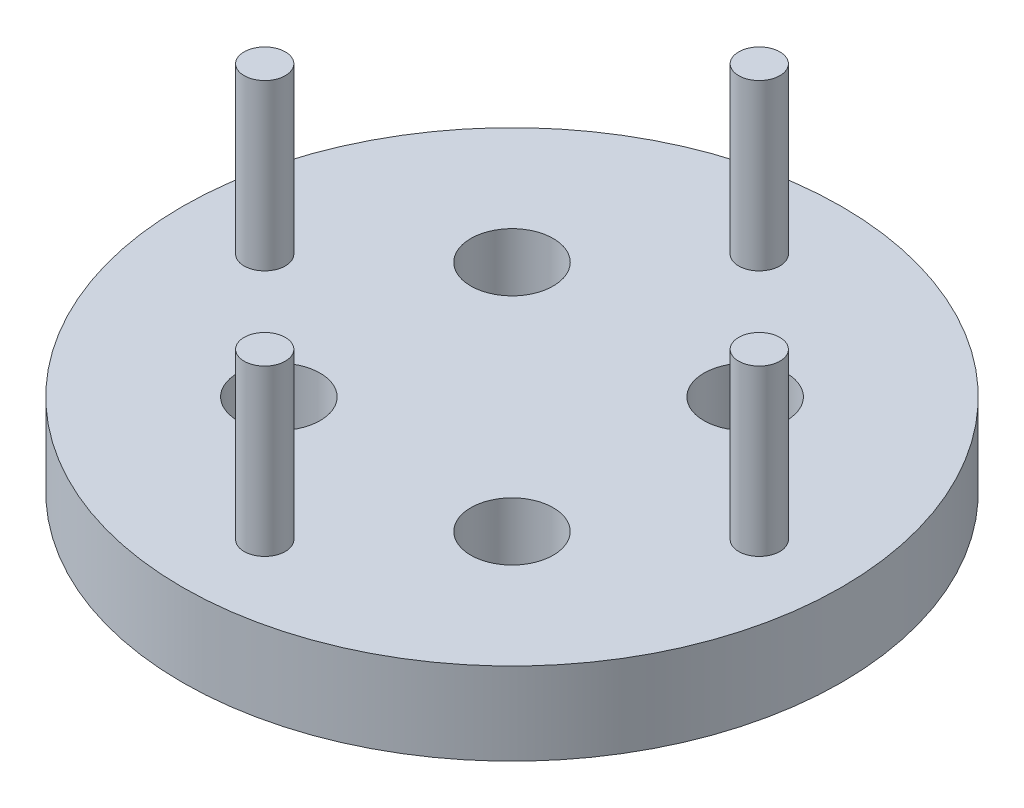
ISO-10303-21;
HEADER;
FILE_DESCRIPTION(('STEP AP214'),'2;1');
FILE_NAME('part.step','',(''),(''),'','','');
FILE_SCHEMA(('AUTOMOTIVE_DESIGN { 1 0 10303 214 1 1 1 1 }'));
ENDSEC;
DATA;
#1=APPLICATION_CONTEXT('core data for automotive mechanical design processes');
#2=APPLICATION_PROTOCOL_DEFINITION('international standard','automotive_design',2000,#1);
#3=PRODUCT_CONTEXT('',#1,'mechanical');
#4=PRODUCT('Part','Part','',(#3));
#5=PRODUCT_RELATED_PRODUCT_CATEGORY('part','',(#4));
#6=PRODUCT_DEFINITION_FORMATION('','',#4);
#7=PRODUCT_DEFINITION_CONTEXT('part definition',#1,'design');
#8=PRODUCT_DEFINITION('design','',#6,#7);
#9=PRODUCT_DEFINITION_SHAPE('','',#8);
#10=(LENGTH_UNIT() NAMED_UNIT(*) SI_UNIT(.MILLI.,.METRE.));
#11=(NAMED_UNIT(*) PLANE_ANGLE_UNIT() SI_UNIT($,.RADIAN.));
#12=(NAMED_UNIT(*) SI_UNIT($,.STERADIAN.) SOLID_ANGLE_UNIT());
#13=UNCERTAINTY_MEASURE_WITH_UNIT(LENGTH_MEASURE(1.E-05),#10,'distance_accuracy_value','');
#14=(GEOMETRIC_REPRESENTATION_CONTEXT(3) GLOBAL_UNCERTAINTY_ASSIGNED_CONTEXT((#13)) GLOBAL_UNIT_ASSIGNED_CONTEXT((#10,
#11,#12)) REPRESENTATION_CONTEXT('',''));
#15=CARTESIAN_POINT('',(0.,0.,0.));
#16=DIRECTION('',(0.,0.,1.));
#17=DIRECTION('',(1.,0.,0.));
#18=AXIS2_PLACEMENT_3D('',#15,#16,#17);
#19=CARTESIAN_POINT('',(0.,6.35,0.));
#20=DIRECTION('',(0.,-1.,0.));
#21=DIRECTION('',(0.,0.,-1.));
#22=AXIS2_PLACEMENT_3D('',#19,#20,#21);
#23=CYLINDRICAL_SURFACE('',#22,25.4);
#24=CARTESIAN_POINT('',(0.,6.35,0.));
#25=DIRECTION('',(0.,1.,0.));
#26=DIRECTION('',(0.,0.,1.));
#27=AXIS2_PLACEMENT_3D('',#24,#25,#26);
#28=CIRCLE('',#27,25.4);
#29=CARTESIAN_POINT('',(0.,6.35,25.4));
#30=VERTEX_POINT('',#29);
#31=EDGE_CURVE('E10',#30,#30,#28,.T.);
#32=ORIENTED_EDGE('',*,*,#31,.F.);
#33=EDGE_LOOP('',(#32));
#34=FACE_BOUND('',#33,.T.);
#35=CARTESIAN_POINT('',(0.,0.,0.));
#36=DIRECTION('',(0.,1.,0.));
#37=DIRECTION('',(0.,0.,1.));
#38=AXIS2_PLACEMENT_3D('',#35,#36,#37);
#39=CIRCLE('',#38,25.4);
#40=CARTESIAN_POINT('',(0.,0.,25.4));
#41=VERTEX_POINT('',#40);
#42=EDGE_CURVE('E34',#41,#41,#39,.T.);
#43=ORIENTED_EDGE('',*,*,#42,.T.);
#44=EDGE_LOOP('',(#43));
#45=FACE_BOUND('',#44,.T.);
#46=ADVANCED_FACE('F31',(#34,#45),#23,.T.);
#47=CARTESIAN_POINT('',(0.,6.35,0.));
#48=DIRECTION('',(0.,1.,0.));
#49=DIRECTION('',(0.,0.,1.));
#50=AXIS2_PLACEMENT_3D('',#47,#48,#49);
#51=PLANE('',#50);
#52=CARTESIAN_POINT('',(8.98025612106907,6.35,8.98025612106924));
#53=DIRECTION('',(0.,1.,0.));
#54=DIRECTION('',(0.,0.,1.));
#55=AXIS2_PLACEMENT_3D('',#52,#53,#54);
#56=CIRCLE('',#55,3.175);
#57=CARTESIAN_POINT('',(8.98025612106907,6.35,12.1552561210692));
#58=VERTEX_POINT('',#57);
#59=EDGE_CURVE('E72',#58,#58,#56,.T.);
#60=ORIENTED_EDGE('',*,*,#59,.F.);
#61=EDGE_LOOP('',(#60));
#62=FACE_BOUND('',#61,.T.);
#63=CARTESIAN_POINT('',(-8.98025612106921,6.35,8.9802561210691));
#64=DIRECTION('',(0.,1.,0.));
#65=DIRECTION('',(0.,0.,1.));
#66=AXIS2_PLACEMENT_3D('',#63,#64,#65);
#67=CIRCLE('',#66,3.175);
#68=CARTESIAN_POINT('',(-8.98025612106921,6.35,12.1552561210691));
#69=VERTEX_POINT('',#68);
#70=EDGE_CURVE('E75',#69,#69,#67,.T.);
#71=ORIENTED_EDGE('',*,*,#70,.F.);
#72=EDGE_LOOP('',(#71));
#73=FACE_BOUND('',#72,.T.);
#74=CARTESIAN_POINT('',(-8.980256121069,6.35,-8.9802561210693));
#75=DIRECTION('',(0.,1.,0.));
#76=DIRECTION('',(0.,0.,1.));
#77=AXIS2_PLACEMENT_3D('',#74,#75,#76);
#78=CIRCLE('',#77,3.175);
#79=CARTESIAN_POINT('',(-8.980256121069,6.35,-5.8052561210693));
#80=VERTEX_POINT('',#79);
#81=EDGE_CURVE('E78',#80,#80,#78,.T.);
#82=ORIENTED_EDGE('',*,*,#81,.F.);
#83=EDGE_LOOP('',(#82));
#84=FACE_BOUND('',#83,.T.);
#85=CARTESIAN_POINT('',(8.98025612106921,6.35,-8.9802561210691));
#86=DIRECTION('',(0.,1.,0.));
#87=DIRECTION('',(0.,0.,1.));
#88=AXIS2_PLACEMENT_3D('',#85,#86,#87);
#89=CIRCLE('',#88,3.175);
#90=CARTESIAN_POINT('',(8.98025612106921,6.35,-5.8052561210691));
#91=VERTEX_POINT('',#90);
#92=EDGE_CURVE('E64',#91,#91,#89,.T.);
#93=ORIENTED_EDGE('',*,*,#92,.F.);
#94=EDGE_LOOP('',(#93));
#95=FACE_BOUND('',#94,.T.);
#96=CARTESIAN_POINT('',(-2.01871110667261E-13,6.35,-19.05));
#97=DIRECTION('',(0.,1.,0.));
#98=DIRECTION('',(-1.,0.,0.));
#99=AXIS2_PLACEMENT_3D('',#96,#97,#98);
#100=CIRCLE('',#99,1.5875);
#101=CARTESIAN_POINT('',(-1.5875000000002,6.35,-19.05));
#102=VERTEX_POINT('',#101);
#103=EDGE_CURVE('E61',#102,#102,#100,.T.);
#104=ORIENTED_EDGE('',*,*,#103,.F.);
#105=EDGE_LOOP('',(#104));
#106=FACE_BOUND('',#105,.T.);
#107=CARTESIAN_POINT('',(19.05,6.35,0.));
#108=DIRECTION('',(0.,1.,0.));
#109=DIRECTION('',(0.,0.,-1.));
#110=AXIS2_PLACEMENT_3D('',#107,#108,#109);
#111=CIRCLE('',#110,1.5875);
#112=CARTESIAN_POINT('',(19.05,6.35,-1.58750000000001));
#113=VERTEX_POINT('',#112);
#114=EDGE_CURVE('E55',#113,#113,#111,.T.);
#115=ORIENTED_EDGE('',*,*,#114,.F.);
#116=EDGE_LOOP('',(#115));
#117=FACE_BOUND('',#116,.T.);
#118=CARTESIAN_POINT('',(0.,6.35,19.05));
#119=DIRECTION('',(0.,1.,0.));
#120=DIRECTION('',(1.,0.,0.));
#121=AXIS2_PLACEMENT_3D('',#118,#119,#120);
#122=CIRCLE('',#121,1.5875);
#123=CARTESIAN_POINT('',(1.58750000000007,6.35,19.05));
#124=VERTEX_POINT('',#123);
#125=EDGE_CURVE('E49',#124,#124,#122,.T.);
#126=ORIENTED_EDGE('',*,*,#125,.F.);
#127=EDGE_LOOP('',(#126));
#128=FACE_BOUND('',#127,.T.);
#129=CARTESIAN_POINT('',(-19.05,6.35,0.));
#130=DIRECTION('',(0.,1.,0.));
#131=DIRECTION('',(0.,0.,1.));
#132=AXIS2_PLACEMENT_3D('',#129,#130,#131);
#133=CIRCLE('',#132,1.5875);
#134=CARTESIAN_POINT('',(-19.05,6.35,1.58750000000001));
#135=VERTEX_POINT('',#134);
#136=EDGE_CURVE('E43',#135,#135,#133,.T.);
#137=ORIENTED_EDGE('',*,*,#136,.F.);
#138=EDGE_LOOP('',(#137));
#139=FACE_BOUND('',#138,.T.);
#140=ORIENTED_EDGE('',*,*,#31,.T.);
#141=EDGE_LOOP('',(#140));
#142=FACE_BOUND('',#141,.T.);
#143=ADVANCED_FACE('F97',(#62,#73,#84,#95,#106,#117,#128,#139,#142),#51,.T.);
#144=CARTESIAN_POINT('',(0.,0.,0.));
#145=DIRECTION('',(0.,1.,0.));
#146=DIRECTION('',(0.,0.,1.));
#147=AXIS2_PLACEMENT_3D('',#144,#145,#146);
#148=PLANE('',#147);
#149=CARTESIAN_POINT('',(8.98025612106907,0.,8.98025612106924));
#150=DIRECTION('',(0.,-1.,0.));
#151=DIRECTION('',(1.,0.,0.));
#152=AXIS2_PLACEMENT_3D('',#149,#150,#151);
#153=CIRCLE('',#152,3.175);
#154=CARTESIAN_POINT('',(12.1552561210691,0.,8.98025612106925));
#155=VERTEX_POINT('',#154);
#156=EDGE_CURVE('E81',#155,#155,#153,.T.);
#157=ORIENTED_EDGE('',*,*,#156,.F.);
#158=EDGE_LOOP('',(#157));
#159=FACE_BOUND('',#158,.T.);
#160=CARTESIAN_POINT('',(-8.98025612106921,0.,8.9802561210691));
#161=DIRECTION('',(0.,-1.,0.));
#162=DIRECTION('',(0.,0.,1.));
#163=AXIS2_PLACEMENT_3D('',#160,#161,#162);
#164=CIRCLE('',#163,3.175);
#165=CARTESIAN_POINT('',(-8.98025612106921,0.,12.1552561210691));
#166=VERTEX_POINT('',#165);
#167=EDGE_CURVE('E85',#166,#166,#164,.T.);
#168=ORIENTED_EDGE('',*,*,#167,.F.);
#169=EDGE_LOOP('',(#168));
#170=FACE_BOUND('',#169,.T.);
#171=CARTESIAN_POINT('',(-8.980256121069,0.,-8.9802561210693));
#172=DIRECTION('',(0.,-1.,0.));
#173=DIRECTION('',(-1.,0.,0.));
#174=AXIS2_PLACEMENT_3D('',#171,#172,#173);
#175=CIRCLE('',#174,3.175);
#176=CARTESIAN_POINT('',(-12.155256121069,0.,-8.98025612106933));
#177=VERTEX_POINT('',#176);
#178=EDGE_CURVE('E82',#177,#177,#175,.T.);
#179=ORIENTED_EDGE('',*,*,#178,.F.);
#180=EDGE_LOOP('',(#179));
#181=FACE_BOUND('',#180,.T.);
#182=CARTESIAN_POINT('',(8.98025612106921,0.,-8.9802561210691));
#183=DIRECTION('',(0.,-1.,0.));
#184=DIRECTION('',(0.,0.,-1.));
#185=AXIS2_PLACEMENT_3D('',#182,#183,#184);
#186=CIRCLE('',#185,3.175);
#187=CARTESIAN_POINT('',(8.98025612106921,0.,-12.1552561210691));
#188=VERTEX_POINT('',#187);
#189=EDGE_CURVE('E69',#188,#188,#186,.T.);
#190=ORIENTED_EDGE('',*,*,#189,.F.);
#191=EDGE_LOOP('',(#190));
#192=FACE_BOUND('',#191,.T.);
#193=ORIENTED_EDGE('',*,*,#42,.F.);
#194=EDGE_LOOP('',(#193));
#195=FACE_BOUND('',#194,.T.);
#196=ADVANCED_FACE('F93',(#159,#170,#181,#192,#195),#148,.F.);
#197=CARTESIAN_POINT('',(-19.05,19.05,0.));
#198=DIRECTION('',(0.,-1.,0.));
#199=DIRECTION('',(0.,0.,-1.));
#200=AXIS2_PLACEMENT_3D('',#197,#198,#199);
#201=CYLINDRICAL_SURFACE('',#200,1.5875);
#202=CARTESIAN_POINT('',(-19.05,19.05,0.));
#203=DIRECTION('',(0.,1.,0.));
#204=DIRECTION('',(0.,0.,1.));
#205=AXIS2_PLACEMENT_3D('',#202,#203,#204);
#206=CIRCLE('',#205,1.5875);
#207=CARTESIAN_POINT('',(-19.05,19.05,1.58750000000001));
#208=VERTEX_POINT('',#207);
#209=EDGE_CURVE('E41',#208,#208,#206,.T.);
#210=ORIENTED_EDGE('',*,*,#209,.F.);
#211=EDGE_LOOP('',(#210));
#212=FACE_BOUND('',#211,.T.);
#213=ORIENTED_EDGE('',*,*,#136,.T.);
#214=EDGE_LOOP('',(#213));
#215=FACE_BOUND('',#214,.T.);
#216=ADVANCED_FACE('F96',(#212,#215),#201,.T.);
#217=CARTESIAN_POINT('',(-19.05,19.05,0.));
#218=DIRECTION('',(0.,1.,0.));
#219=DIRECTION('',(0.,0.,1.));
#220=AXIS2_PLACEMENT_3D('',#217,#218,#219);
#221=PLANE('',#220);
#222=ORIENTED_EDGE('',*,*,#209,.T.);
#223=EDGE_LOOP('',(#222));
#224=FACE_BOUND('',#223,.T.);
#225=ADVANCED_FACE('F121',(#224),#221,.T.);
#226=CARTESIAN_POINT('',(0.,19.05,19.05));
#227=DIRECTION('',(0.,-1.,0.));
#228=DIRECTION('',(0.,0.,-1.));
#229=AXIS2_PLACEMENT_3D('',#226,#227,#228);
#230=CYLINDRICAL_SURFACE('',#229,1.5875);
#231=CARTESIAN_POINT('',(0.,19.05,19.05));
#232=DIRECTION('',(0.,1.,0.));
#233=DIRECTION('',(1.,0.,0.));
#234=AXIS2_PLACEMENT_3D('',#231,#232,#233);
#235=CIRCLE('',#234,1.5875);
#236=CARTESIAN_POINT('',(1.58750000000007,19.05,19.05));
#237=VERTEX_POINT('',#236);
#238=EDGE_CURVE('E46',#237,#237,#235,.T.);
#239=ORIENTED_EDGE('',*,*,#238,.F.);
#240=EDGE_LOOP('',(#239));
#241=FACE_BOUND('',#240,.T.);
#242=ORIENTED_EDGE('',*,*,#125,.T.);
#243=EDGE_LOOP('',(#242));
#244=FACE_BOUND('',#243,.T.);
#245=ADVANCED_FACE('F125',(#241,#244),#230,.T.);
#246=CARTESIAN_POINT('',(0.,19.05,19.05));
#247=DIRECTION('',(0.,1.,0.));
#248=DIRECTION('',(1.,0.,0.));
#249=AXIS2_PLACEMENT_3D('',#246,#247,#248);
#250=PLANE('',#249);
#251=ORIENTED_EDGE('',*,*,#238,.T.);
#252=EDGE_LOOP('',(#251));
#253=FACE_BOUND('',#252,.T.);
#254=ADVANCED_FACE('F129',(#253),#250,.T.);
#255=CARTESIAN_POINT('',(19.05,19.05,0.));
#256=DIRECTION('',(0.,-1.,0.));
#257=DIRECTION('',(0.,0.,-1.));
#258=AXIS2_PLACEMENT_3D('',#255,#256,#257);
#259=CYLINDRICAL_SURFACE('',#258,1.5875);
#260=CARTESIAN_POINT('',(19.05,19.05,0.));
#261=DIRECTION('',(0.,1.,0.));
#262=DIRECTION('',(0.,0.,-1.));
#263=AXIS2_PLACEMENT_3D('',#260,#261,#262);
#264=CIRCLE('',#263,1.5875);
#265=CARTESIAN_POINT('',(19.05,19.05,-1.58750000000001));
#266=VERTEX_POINT('',#265);
#267=EDGE_CURVE('E52',#266,#266,#264,.T.);
#268=ORIENTED_EDGE('',*,*,#267,.F.);
#269=EDGE_LOOP('',(#268));
#270=FACE_BOUND('',#269,.T.);
#271=ORIENTED_EDGE('',*,*,#114,.T.);
#272=EDGE_LOOP('',(#271));
#273=FACE_BOUND('',#272,.T.);
#274=ADVANCED_FACE('F133',(#270,#273),#259,.T.);
#275=CARTESIAN_POINT('',(19.05,19.05,0.));
#276=DIRECTION('',(0.,1.,0.));
#277=DIRECTION('',(0.,0.,-1.));
#278=AXIS2_PLACEMENT_3D('',#275,#276,#277);
#279=PLANE('',#278);
#280=ORIENTED_EDGE('',*,*,#267,.T.);
#281=EDGE_LOOP('',(#280));
#282=FACE_BOUND('',#281,.T.);
#283=ADVANCED_FACE('F137',(#282),#279,.T.);
#284=CARTESIAN_POINT('',(-2.01871110667261E-13,19.05,-19.05));
#285=DIRECTION('',(0.,-1.,0.));
#286=DIRECTION('',(0.,0.,-1.));
#287=AXIS2_PLACEMENT_3D('',#284,#285,#286);
#288=CYLINDRICAL_SURFACE('',#287,1.5875);
#289=CARTESIAN_POINT('',(-2.01871110667261E-13,19.05,-19.05));
#290=DIRECTION('',(0.,1.,0.));
#291=DIRECTION('',(-1.,0.,0.));
#292=AXIS2_PLACEMENT_3D('',#289,#290,#291);
#293=CIRCLE('',#292,1.5875);
#294=CARTESIAN_POINT('',(-1.5875000000002,19.05,-19.05));
#295=VERTEX_POINT('',#294);
#296=EDGE_CURVE('E58',#295,#295,#293,.T.);
#297=ORIENTED_EDGE('',*,*,#296,.F.);
#298=EDGE_LOOP('',(#297));
#299=FACE_BOUND('',#298,.T.);
#300=ORIENTED_EDGE('',*,*,#103,.T.);
#301=EDGE_LOOP('',(#300));
#302=FACE_BOUND('',#301,.T.);
#303=ADVANCED_FACE('F141',(#299,#302),#288,.T.);
#304=CARTESIAN_POINT('',(-2.01871110667261E-13,19.05,-19.05));
#305=DIRECTION('',(0.,1.,0.));
#306=DIRECTION('',(-1.,0.,0.));
#307=AXIS2_PLACEMENT_3D('',#304,#305,#306);
#308=PLANE('',#307);
#309=ORIENTED_EDGE('',*,*,#296,.T.);
#310=EDGE_LOOP('',(#309));
#311=FACE_BOUND('',#310,.T.);
#312=ADVANCED_FACE('F145',(#311),#308,.T.);
#313=CARTESIAN_POINT('',(8.98025612106921,19.05,-8.9802561210691));
#314=DIRECTION('',(0.,-1.,0.));
#315=DIRECTION('',(0.,0.,-1.));
#316=AXIS2_PLACEMENT_3D('',#313,#314,#315);
#317=CYLINDRICAL_SURFACE('',#316,3.175);
#318=ORIENTED_EDGE('',*,*,#92,.T.);
#319=EDGE_LOOP('',(#318));
#320=FACE_BOUND('',#319,.T.);
#321=ORIENTED_EDGE('',*,*,#189,.T.);
#322=EDGE_LOOP('',(#321));
#323=FACE_BOUND('',#322,.T.);
#324=ADVANCED_FACE('F149',(#320,#323),#317,.F.);
#325=CARTESIAN_POINT('',(-8.980256121069,19.05,-8.9802561210693));
#326=DIRECTION('',(0.,-1.,0.));
#327=DIRECTION('',(0.,0.,-1.));
#328=AXIS2_PLACEMENT_3D('',#325,#326,#327);
#329=CYLINDRICAL_SURFACE('',#328,3.175);
#330=ORIENTED_EDGE('',*,*,#81,.T.);
#331=EDGE_LOOP('',(#330));
#332=FACE_BOUND('',#331,.T.);
#333=ORIENTED_EDGE('',*,*,#178,.T.);
#334=EDGE_LOOP('',(#333));
#335=FACE_BOUND('',#334,.T.);
#336=ADVANCED_FACE('F153',(#332,#335),#329,.F.);
#337=CARTESIAN_POINT('',(-8.98025612106921,19.05,8.9802561210691));
#338=DIRECTION('',(0.,-1.,0.));
#339=DIRECTION('',(0.,0.,-1.));
#340=AXIS2_PLACEMENT_3D('',#337,#338,#339);
#341=CYLINDRICAL_SURFACE('',#340,3.175);
#342=ORIENTED_EDGE('',*,*,#70,.T.);
#343=EDGE_LOOP('',(#342));
#344=FACE_BOUND('',#343,.T.);
#345=ORIENTED_EDGE('',*,*,#167,.T.);
#346=EDGE_LOOP('',(#345));
#347=FACE_BOUND('',#346,.T.);
#348=ADVANCED_FACE('F157',(#344,#347),#341,.F.);
#349=CARTESIAN_POINT('',(8.98025612106907,19.05,8.98025612106924));
#350=DIRECTION('',(0.,-1.,0.));
#351=DIRECTION('',(0.,0.,-1.));
#352=AXIS2_PLACEMENT_3D('',#349,#350,#351);
#353=CYLINDRICAL_SURFACE('',#352,3.175);
#354=ORIENTED_EDGE('',*,*,#59,.T.);
#355=EDGE_LOOP('',(#354));
#356=FACE_BOUND('',#355,.T.);
#357=ORIENTED_EDGE('',*,*,#156,.T.);
#358=EDGE_LOOP('',(#357));
#359=FACE_BOUND('',#358,.T.);
#360=ADVANCED_FACE('F91',(#356,#359),#353,.F.);
#361=CLOSED_SHELL('',(#46,#143,#196,#216,#225,#245,#254,#274,#283,#303,#312,#324,#336,#348,#360));
#362=MANIFOLD_SOLID_BREP('B2',#361);
#363=ADVANCED_BREP_SHAPE_REPRESENTATION('',(#18,#362),#14);
#364=SHAPE_DEFINITION_REPRESENTATION(#9,#363);
ENDSEC;
END-ISO-10303-21;
